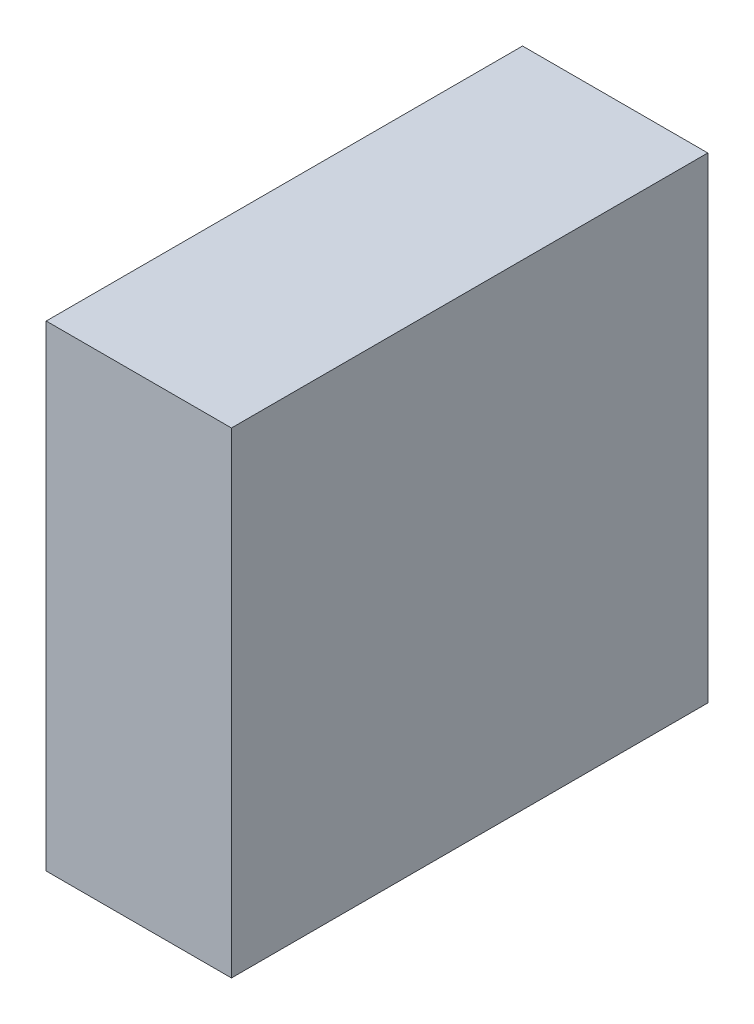
ISO-10303-21;
HEADER;
FILE_DESCRIPTION(('STEP AP214'),'2;1');
FILE_NAME('part.step','',(''),(''),'','','');
FILE_SCHEMA(('AUTOMOTIVE_DESIGN { 1 0 10303 214 1 1 1 1 }'));
ENDSEC;
DATA;
#1=APPLICATION_CONTEXT('core data for automotive mechanical design processes');
#2=APPLICATION_PROTOCOL_DEFINITION('international standard','automotive_design',2000,#1);
#3=PRODUCT_CONTEXT('',#1,'mechanical');
#4=PRODUCT('Part','Part','',(#3));
#5=PRODUCT_RELATED_PRODUCT_CATEGORY('part','',(#4));
#6=PRODUCT_DEFINITION_FORMATION('','',#4);
#7=PRODUCT_DEFINITION_CONTEXT('part definition',#1,'design');
#8=PRODUCT_DEFINITION('design','',#6,#7);
#9=PRODUCT_DEFINITION_SHAPE('','',#8);
#10=(LENGTH_UNIT() NAMED_UNIT(*) SI_UNIT(.MILLI.,.METRE.));
#11=(NAMED_UNIT(*) PLANE_ANGLE_UNIT() SI_UNIT($,.RADIAN.));
#12=(NAMED_UNIT(*) SI_UNIT($,.STERADIAN.) SOLID_ANGLE_UNIT());
#13=UNCERTAINTY_MEASURE_WITH_UNIT(LENGTH_MEASURE(1.E-05),#10,'distance_accuracy_value','');
#14=(GEOMETRIC_REPRESENTATION_CONTEXT(3) GLOBAL_UNCERTAINTY_ASSIGNED_CONTEXT((#13)) GLOBAL_UNIT_ASSIGNED_CONTEXT((#10,
#11,#12)) REPRESENTATION_CONTEXT('',''));
#15=CARTESIAN_POINT('',(0.,0.,0.));
#16=DIRECTION('',(0.,0.,1.));
#17=DIRECTION('',(1.,0.,0.));
#18=AXIS2_PLACEMENT_3D('',#15,#16,#17);
#19=CARTESIAN_POINT('',(-0.3499993,0.90000074,0.));
#20=DIRECTION('',(1.,0.,0.));
#21=DIRECTION('',(0.,0.,-1.));
#22=AXIS2_PLACEMENT_3D('',#19,#20,#21);
#23=PLANE('',#22);
#24=DIRECTION('',(0.,0.,1.));
#25=VECTOR('',#24,1.);
#26=CARTESIAN_POINT('',(-0.3499993,-0.8999982,0.));
#27=LINE('',#26,#25);
#28=CARTESIAN_POINT('',(-0.3499993,-0.8999982,0.));
#29=VERTEX_POINT('',#28);
#30=CARTESIAN_POINT('',(-0.3499993,-0.8999982,1.79999894));
#31=VERTEX_POINT('',#30);
#32=EDGE_CURVE('E20',#29,#31,#27,.T.);
#33=ORIENTED_EDGE('',*,*,#32,.T.);
#34=DIRECTION('',(0.,1.,0.));
#35=VECTOR('',#34,1.);
#36=CARTESIAN_POINT('',(-0.3499993,-0.8999982,1.79999894));
#37=LINE('',#36,#35);
#38=CARTESIAN_POINT('',(-0.3499993,0.90000074,1.79999894));
#39=VERTEX_POINT('',#38);
#40=EDGE_CURVE('E55',#31,#39,#37,.T.);
#41=ORIENTED_EDGE('',*,*,#40,.T.);
#42=DIRECTION('',(0.,0.,-1.));
#43=VECTOR('',#42,1.);
#44=CARTESIAN_POINT('',(-0.3499993,0.90000074,0.));
#45=LINE('',#44,#43);
#46=CARTESIAN_POINT('',(-0.3499993,0.90000074,0.));
#47=VERTEX_POINT('',#46);
#48=EDGE_CURVE('E76',#39,#47,#45,.T.);
#49=ORIENTED_EDGE('',*,*,#48,.T.);
#50=DIRECTION('',(0.,1.,0.));
#51=VECTOR('',#50,1.);
#52=CARTESIAN_POINT('',(-0.3499993,-0.8999982,0.));
#53=LINE('',#52,#51);
#54=EDGE_CURVE('E58',#29,#47,#53,.T.);
#55=ORIENTED_EDGE('',*,*,#54,.F.);
#56=EDGE_LOOP('',(#33,#41,#49,#55));
#57=FACE_BOUND('',#56,.T.);
#58=ADVANCED_FACE('F17',(#57),#23,.F.);
#59=CARTESIAN_POINT('',(-0.3499993,-0.8999982,0.));
#60=DIRECTION('',(0.,1.,0.));
#61=DIRECTION('',(0.,0.,1.));
#62=AXIS2_PLACEMENT_3D('',#59,#60,#61);
#63=PLANE('',#62);
#64=DIRECTION('',(0.,0.,1.));
#65=VECTOR('',#64,1.);
#66=CARTESIAN_POINT('',(0.35000184,-0.8999982,0.));
#67=LINE('',#66,#65);
#68=CARTESIAN_POINT('',(0.35000184,-0.8999982,0.));
#69=VERTEX_POINT('',#68);
#70=CARTESIAN_POINT('',(0.35000184,-0.8999982,1.79999894));
#71=VERTEX_POINT('',#70);
#72=EDGE_CURVE('E73',#69,#71,#67,.T.);
#73=ORIENTED_EDGE('',*,*,#72,.T.);
#74=DIRECTION('',(-1.,0.,0.));
#75=VECTOR('',#74,1.);
#76=CARTESIAN_POINT('',(0.35000184,-0.8999982,1.79999894));
#77=LINE('',#76,#75);
#78=EDGE_CURVE('E63',#71,#31,#77,.T.);
#79=ORIENTED_EDGE('',*,*,#78,.T.);
#80=ORIENTED_EDGE('',*,*,#32,.F.);
#81=DIRECTION('',(-1.,0.,0.));
#82=VECTOR('',#81,1.);
#83=CARTESIAN_POINT('',(0.35000184,-0.8999982,0.));
#84=LINE('',#83,#82);
#85=EDGE_CURVE('E78',#69,#29,#84,.T.);
#86=ORIENTED_EDGE('',*,*,#85,.F.);
#87=EDGE_LOOP('',(#73,#79,#80,#86));
#88=FACE_BOUND('',#87,.T.);
#89=ADVANCED_FACE('F72',(#88),#63,.F.);
#90=CARTESIAN_POINT('',(0.35000184,-0.8999982,1.79999894));
#91=DIRECTION('',(0.,0.,-1.));
#92=DIRECTION('',(-1.,0.,0.));
#93=AXIS2_PLACEMENT_3D('',#90,#91,#92);
#94=PLANE('',#93);
#95=DIRECTION('',(1.,0.,0.));
#96=VECTOR('',#95,1.);
#97=CARTESIAN_POINT('',(0.35000184,0.90000074,1.79999894));
#98=LINE('',#97,#96);
#99=CARTESIAN_POINT('',(0.35000184,0.90000074,1.79999894));
#100=VERTEX_POINT('',#99);
#101=EDGE_CURVE('E69',#100,#39,#98,.F.);
#102=ORIENTED_EDGE('',*,*,#101,.T.);
#103=ORIENTED_EDGE('',*,*,#40,.F.);
#104=ORIENTED_EDGE('',*,*,#78,.F.);
#105=DIRECTION('',(0.,1.,0.));
#106=VECTOR('',#105,1.);
#107=CARTESIAN_POINT('',(0.35000184,-0.8999982,1.79999894));
#108=LINE('',#107,#106);
#109=EDGE_CURVE('E83',#71,#100,#108,.T.);
#110=ORIENTED_EDGE('',*,*,#109,.T.);
#111=EDGE_LOOP('',(#102,#103,#104,#110));
#112=FACE_BOUND('',#111,.T.);
#113=ADVANCED_FACE('F66',(#112),#94,.F.);
#114=CARTESIAN_POINT('',(0.35000184,0.90000074,0.));
#115=DIRECTION('',(0.,-1.,0.));
#116=DIRECTION('',(0.,0.,-1.));
#117=AXIS2_PLACEMENT_3D('',#114,#115,#116);
#118=PLANE('',#117);
#119=ORIENTED_EDGE('',*,*,#48,.F.);
#120=ORIENTED_EDGE('',*,*,#101,.F.);
#121=DIRECTION('',(0.,0.,1.));
#122=VECTOR('',#121,1.);
#123=CARTESIAN_POINT('',(0.35000184,0.90000074,0.));
#124=LINE('',#123,#122);
#125=CARTESIAN_POINT('',(0.35000184,0.90000074,0.));
#126=VERTEX_POINT('',#125);
#127=EDGE_CURVE('E26',#100,#126,#124,.F.);
#128=ORIENTED_EDGE('',*,*,#127,.T.);
#129=DIRECTION('',(-1.,0.,0.));
#130=VECTOR('',#129,1.);
#131=CARTESIAN_POINT('',(0.35000184,0.90000074,0.));
#132=LINE('',#131,#130);
#133=EDGE_CURVE('E34',#47,#126,#132,.F.);
#134=ORIENTED_EDGE('',*,*,#133,.F.);
#135=EDGE_LOOP('',(#119,#120,#128,#134));
#136=FACE_BOUND('',#135,.T.);
#137=ADVANCED_FACE('F88',(#136),#118,.F.);
#138=CARTESIAN_POINT('',(0.35000184,-0.8999982,0.));
#139=DIRECTION('',(0.,0.,-1.));
#140=DIRECTION('',(-1.,0.,0.));
#141=AXIS2_PLACEMENT_3D('',#138,#139,#140);
#142=PLANE('',#141);
#143=ORIENTED_EDGE('',*,*,#133,.T.);
#144=DIRECTION('',(0.,1.,0.));
#145=VECTOR('',#144,1.);
#146=CARTESIAN_POINT('',(0.35000184,-0.8999982,0.));
#147=LINE('',#146,#145);
#148=EDGE_CURVE('E11',#126,#69,#147,.F.);
#149=ORIENTED_EDGE('',*,*,#148,.T.);
#150=ORIENTED_EDGE('',*,*,#85,.T.);
#151=ORIENTED_EDGE('',*,*,#54,.T.);
#152=EDGE_LOOP('',(#143,#149,#150,#151));
#153=FACE_BOUND('',#152,.T.);
#154=ADVANCED_FACE('F91',(#153),#142,.T.);
#155=CARTESIAN_POINT('',(0.35000184,-0.8999982,0.));
#156=DIRECTION('',(-1.,0.,0.));
#157=DIRECTION('',(0.,0.,1.));
#158=AXIS2_PLACEMENT_3D('',#155,#156,#157);
#159=PLANE('',#158);
#160=ORIENTED_EDGE('',*,*,#127,.F.);
#161=ORIENTED_EDGE('',*,*,#109,.F.);
#162=ORIENTED_EDGE('',*,*,#72,.F.);
#163=ORIENTED_EDGE('',*,*,#148,.F.);
#164=EDGE_LOOP('',(#160,#161,#162,#163));
#165=FACE_BOUND('',#164,.T.);
#166=ADVANCED_FACE('F90',(#165),#159,.F.);
#167=CLOSED_SHELL('',(#58,#89,#113,#137,#154,#166));
#168=MANIFOLD_SOLID_BREP('B1',#167);
#169=ADVANCED_BREP_SHAPE_REPRESENTATION('',(#18,#168),#14);
#170=SHAPE_DEFINITION_REPRESENTATION(#9,#169);
ENDSEC;
END-ISO-10303-21;
